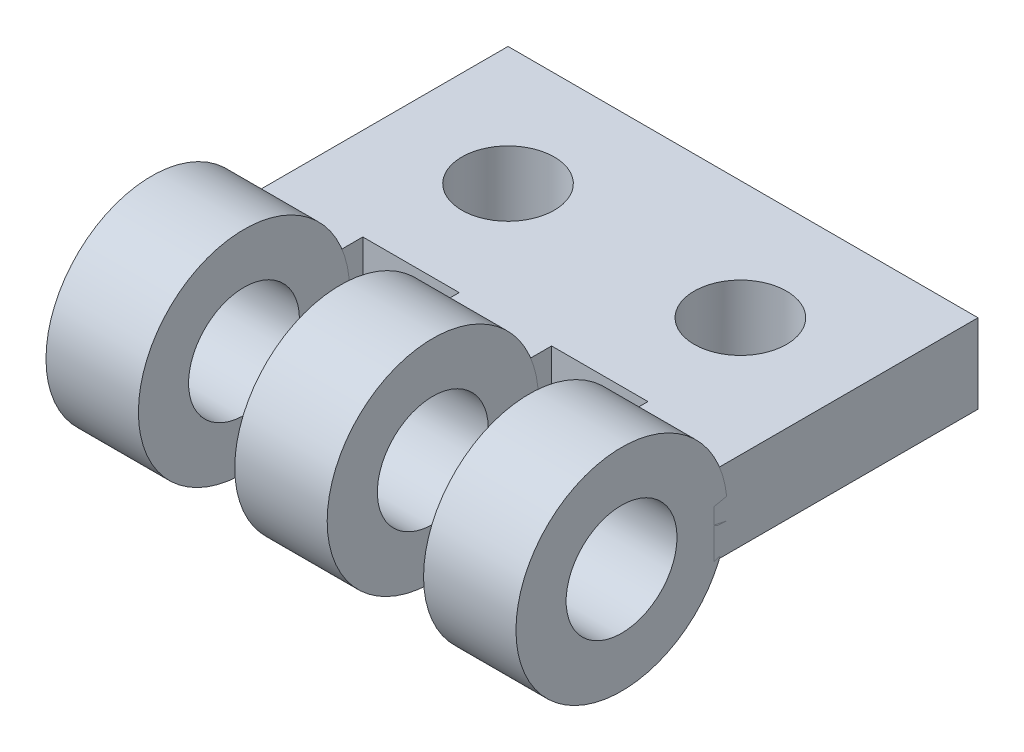
ISO-10303-21;
HEADER;
FILE_DESCRIPTION(('STEP AP214'),'2;1');
FILE_NAME('part.step','',(''),(''),'','','');
FILE_SCHEMA(('AUTOMOTIVE_DESIGN { 1 0 10303 214 1 1 1 1 }'));
ENDSEC;
DATA;
#1=APPLICATION_CONTEXT('core data for automotive mechanical design processes');
#2=APPLICATION_PROTOCOL_DEFINITION('international standard','automotive_design',2000,#1);
#3=PRODUCT_CONTEXT('',#1,'mechanical');
#4=PRODUCT('Part','Part','',(#3));
#5=PRODUCT_RELATED_PRODUCT_CATEGORY('part','',(#4));
#6=PRODUCT_DEFINITION_FORMATION('','',#4);
#7=PRODUCT_DEFINITION_CONTEXT('part definition',#1,'design');
#8=PRODUCT_DEFINITION('design','',#6,#7);
#9=PRODUCT_DEFINITION_SHAPE('','',#8);
#10=(LENGTH_UNIT() NAMED_UNIT(*) SI_UNIT(.MILLI.,.METRE.));
#11=(NAMED_UNIT(*) PLANE_ANGLE_UNIT() SI_UNIT($,.RADIAN.));
#12=(NAMED_UNIT(*) SI_UNIT($,.STERADIAN.) SOLID_ANGLE_UNIT());
#13=UNCERTAINTY_MEASURE_WITH_UNIT(LENGTH_MEASURE(1.E-05),#10,'distance_accuracy_value','');
#14=(GEOMETRIC_REPRESENTATION_CONTEXT(3) GLOBAL_UNCERTAINTY_ASSIGNED_CONTEXT((#13)) GLOBAL_UNIT_ASSIGNED_CONTEXT((#10,
#11,#12)) REPRESENTATION_CONTEXT('',''));
#15=CARTESIAN_POINT('',(0.,0.,0.));
#16=DIRECTION('',(0.,0.,1.));
#17=DIRECTION('',(1.,0.,0.));
#18=AXIS2_PLACEMENT_3D('',#15,#16,#17);
#19=CARTESIAN_POINT('',(-14.3,1.5,-13.5));
#20=DIRECTION('',(0.,1.,0.));
#21=DIRECTION('',(0.,0.,1.));
#22=AXIS2_PLACEMENT_3D('',#19,#20,#21);
#23=PLANE('',#22);
#24=CARTESIAN_POINT('',(-1.,1.5,-9.));
#25=DIRECTION('',(0.,1.,0.));
#26=DIRECTION('',(0.,0.,1.));
#27=AXIS2_PLACEMENT_3D('',#24,#25,#26);
#28=CIRCLE('',#27,1.75);
#29=CARTESIAN_POINT('',(-1.,1.5,-7.25));
#30=VERTEX_POINT('',#29);
#31=EDGE_CURVE('E196',#30,#30,#28,.T.);
#32=ORIENTED_EDGE('',*,*,#31,.F.);
#33=EDGE_LOOP('',(#32));
#34=FACE_BOUND('',#33,.T.);
#35=CARTESIAN_POINT('',(-9.8,1.5,-9.));
#36=DIRECTION('',(0.,1.,0.));
#37=DIRECTION('',(0.,0.,-1.));
#38=AXIS2_PLACEMENT_3D('',#35,#36,#37);
#39=CIRCLE('',#38,1.75);
#40=CARTESIAN_POINT('',(-9.8,1.5,-10.75));
#41=VERTEX_POINT('',#40);
#42=EDGE_CURVE('E193',#41,#41,#39,.T.);
#43=ORIENTED_EDGE('',*,*,#42,.F.);
#44=EDGE_LOOP('',(#43));
#45=FACE_BOUND('',#44,.T.);
#46=DIRECTION('',(1.,0.,0.));
#47=VECTOR('',#46,1.);
#48=CARTESIAN_POINT('',(-14.3,1.5,-4.5));
#49=LINE('',#48,#47);
#50=CARTESIAN_POINT('',(-10.8,1.5,-4.5));
#51=VERTEX_POINT('',#50);
#52=CARTESIAN_POINT('',(-7.15,1.5,-4.5));
#53=VERTEX_POINT('',#52);
#54=EDGE_CURVE('E158',#51,#53,#49,.T.);
#55=ORIENTED_EDGE('',*,*,#54,.T.);
#56=DIRECTION('',(0.,0.,1.));
#57=VECTOR('',#56,1.);
#58=CARTESIAN_POINT('',(-7.15,1.5,-13.5));
#59=LINE('',#58,#57);
#60=CARTESIAN_POINT('',(-7.15,1.5,-3.5));
#61=VERTEX_POINT('',#60);
#62=EDGE_CURVE('E171',#53,#61,#59,.T.);
#63=ORIENTED_EDGE('',*,*,#62,.T.);
#64=DIRECTION('',(-1.,0.,0.));
#65=VECTOR('',#64,1.);
#66=CARTESIAN_POINT('',(-14.3,1.5,-3.5));
#67=LINE('',#66,#65);
#68=CARTESIAN_POINT('',(-3.65,1.5,-3.5));
#69=VERTEX_POINT('',#68);
#70=EDGE_CURVE('E230',#69,#61,#67,.T.);
#71=ORIENTED_EDGE('',*,*,#70,.F.);
#72=DIRECTION('',(0.,0.,-1.));
#73=VECTOR('',#72,1.);
#74=CARTESIAN_POINT('',(-3.65,1.5,-13.5));
#75=LINE('',#74,#73);
#76=CARTESIAN_POINT('',(-3.65,1.5,-4.5));
#77=VERTEX_POINT('',#76);
#78=EDGE_CURVE('E79',#69,#77,#75,.T.);
#79=ORIENTED_EDGE('',*,*,#78,.T.);
#80=DIRECTION('',(1.,0.,0.));
#81=VECTOR('',#80,1.);
#82=CARTESIAN_POINT('',(-14.3,1.5,-4.5));
#83=LINE('',#82,#81);
#84=CARTESIAN_POINT('',(0.,1.5,-4.5));
#85=VERTEX_POINT('',#84);
#86=EDGE_CURVE('E195',#77,#85,#83,.T.);
#87=ORIENTED_EDGE('',*,*,#86,.T.);
#88=DIRECTION('',(0.,0.,1.));
#89=VECTOR('',#88,1.);
#90=CARTESIAN_POINT('',(0.,1.5,-13.5));
#91=LINE('',#90,#89);
#92=CARTESIAN_POINT('',(0.,1.5,-3.5));
#93=VERTEX_POINT('',#92);
#94=EDGE_CURVE('E186',#85,#93,#91,.T.);
#95=ORIENTED_EDGE('',*,*,#94,.T.);
#96=CARTESIAN_POINT('',(3.5,1.5,-3.5));
#97=VERTEX_POINT('',#96);
#98=EDGE_CURVE('E207',#97,#93,#67,.T.);
#99=ORIENTED_EDGE('',*,*,#98,.F.);
#100=DIRECTION('',(0.,0.,1.));
#101=VECTOR('',#100,1.);
#102=CARTESIAN_POINT('',(3.5,1.5,-13.5));
#103=LINE('',#102,#101);
#104=CARTESIAN_POINT('',(3.5,1.5,-13.5));
#105=VERTEX_POINT('',#104);
#106=EDGE_CURVE('E234',#105,#97,#103,.T.);
#107=ORIENTED_EDGE('',*,*,#106,.F.);
#108=DIRECTION('',(-1.,0.,0.));
#109=VECTOR('',#108,1.);
#110=CARTESIAN_POINT('',(-14.3,1.5,-13.5));
#111=LINE('',#110,#109);
#112=CARTESIAN_POINT('',(-14.3,1.5,-13.5));
#113=VERTEX_POINT('',#112);
#114=EDGE_CURVE('E215',#105,#113,#111,.T.);
#115=ORIENTED_EDGE('',*,*,#114,.T.);
#116=DIRECTION('',(0.,0.,1.));
#117=VECTOR('',#116,1.);
#118=CARTESIAN_POINT('',(-14.3,1.5,-13.5));
#119=LINE('',#118,#117);
#120=CARTESIAN_POINT('',(-14.3,1.5,-3.5));
#121=VERTEX_POINT('',#120);
#122=EDGE_CURVE('E229',#113,#121,#119,.T.);
#123=ORIENTED_EDGE('',*,*,#122,.T.);
#124=CARTESIAN_POINT('',(-10.8,1.5,-3.5));
#125=VERTEX_POINT('',#124);
#126=EDGE_CURVE('E228',#125,#121,#67,.T.);
#127=ORIENTED_EDGE('',*,*,#126,.F.);
#128=DIRECTION('',(0.,0.,-1.));
#129=VECTOR('',#128,1.);
#130=CARTESIAN_POINT('',(-10.8,1.5,-13.5));
#131=LINE('',#130,#129);
#132=EDGE_CURVE('E72',#125,#51,#131,.T.);
#133=ORIENTED_EDGE('',*,*,#132,.T.);
#134=EDGE_LOOP('',(#55,#63,#71,#79,#87,#95,#99,#107,#115,#123,#127,#133));
#135=FACE_BOUND('',#134,.T.);
#136=ADVANCED_FACE('F57',(#34,#45,#135),#23,.T.);
#137=CARTESIAN_POINT('',(-14.3,-1.5,-13.5));
#138=DIRECTION('',(0.,-1.,0.));
#139=DIRECTION('',(0.,0.,-1.));
#140=AXIS2_PLACEMENT_3D('',#137,#138,#139);
#141=PLANE('',#140);
#142=CARTESIAN_POINT('',(-1.,-1.5,-9.));
#143=DIRECTION('',(0.,-1.,0.));
#144=DIRECTION('',(0.,0.,-1.));
#145=AXIS2_PLACEMENT_3D('',#142,#143,#144);
#146=CIRCLE('',#145,1.75);
#147=CARTESIAN_POINT('',(-1.,-1.5,-10.75));
#148=VERTEX_POINT('',#147);
#149=EDGE_CURVE('E219',#148,#148,#146,.T.);
#150=ORIENTED_EDGE('',*,*,#149,.F.);
#151=EDGE_LOOP('',(#150));
#152=FACE_BOUND('',#151,.T.);
#153=CARTESIAN_POINT('',(-9.8,-1.5,-9.));
#154=DIRECTION('',(0.,-1.,0.));
#155=DIRECTION('',(0.,0.,-1.));
#156=AXIS2_PLACEMENT_3D('',#153,#154,#155);
#157=CIRCLE('',#156,1.75);
#158=CARTESIAN_POINT('',(-9.8,-1.5,-10.75));
#159=VERTEX_POINT('',#158);
#160=EDGE_CURVE('E197',#159,#159,#157,.T.);
#161=ORIENTED_EDGE('',*,*,#160,.F.);
#162=EDGE_LOOP('',(#161));
#163=FACE_BOUND('',#162,.T.);
#164=DIRECTION('',(1.,0.,0.));
#165=VECTOR('',#164,1.);
#166=CARTESIAN_POINT('',(-14.3,-1.5,-3.5));
#167=LINE('',#166,#165);
#168=CARTESIAN_POINT('',(-7.15,-1.5,-3.5));
#169=VERTEX_POINT('',#168);
#170=CARTESIAN_POINT('',(-3.65,-1.5,-3.5));
#171=VERTEX_POINT('',#170);
#172=EDGE_CURVE('E166',#169,#171,#167,.T.);
#173=ORIENTED_EDGE('',*,*,#172,.F.);
#174=DIRECTION('',(0.,0.,-1.));
#175=VECTOR('',#174,1.);
#176=CARTESIAN_POINT('',(-7.15,-1.5,-13.5));
#177=LINE('',#176,#175);
#178=CARTESIAN_POINT('',(-7.15,-1.5,-4.5));
#179=VERTEX_POINT('',#178);
#180=EDGE_CURVE('E168',#169,#179,#177,.T.);
#181=ORIENTED_EDGE('',*,*,#180,.T.);
#182=DIRECTION('',(-1.,0.,0.));
#183=VECTOR('',#182,1.);
#184=CARTESIAN_POINT('',(-14.3,-1.5,-4.5));
#185=LINE('',#184,#183);
#186=CARTESIAN_POINT('',(-10.8,-1.5,-4.5));
#187=VERTEX_POINT('',#186);
#188=EDGE_CURVE('E12',#179,#187,#185,.T.);
#189=ORIENTED_EDGE('',*,*,#188,.T.);
#190=DIRECTION('',(0.,0.,1.));
#191=VECTOR('',#190,1.);
#192=CARTESIAN_POINT('',(-10.8,-1.5,-13.5));
#193=LINE('',#192,#191);
#194=CARTESIAN_POINT('',(-10.8,-1.5,-3.5));
#195=VERTEX_POINT('',#194);
#196=EDGE_CURVE('E147',#187,#195,#193,.T.);
#197=ORIENTED_EDGE('',*,*,#196,.T.);
#198=CARTESIAN_POINT('',(-14.3,-1.5,-3.5));
#199=VERTEX_POINT('',#198);
#200=EDGE_CURVE('E222',#199,#195,#167,.T.);
#201=ORIENTED_EDGE('',*,*,#200,.F.);
#202=DIRECTION('',(0.,0.,1.));
#203=VECTOR('',#202,1.);
#204=CARTESIAN_POINT('',(-14.3,-1.5,-13.5));
#205=LINE('',#204,#203);
#206=CARTESIAN_POINT('',(-14.3,-1.5,-13.5));
#207=VERTEX_POINT('',#206);
#208=EDGE_CURVE('E213',#207,#199,#205,.T.);
#209=ORIENTED_EDGE('',*,*,#208,.F.);
#210=DIRECTION('',(1.,0.,0.));
#211=VECTOR('',#210,1.);
#212=CARTESIAN_POINT('',(-14.3,-1.5,-13.5));
#213=LINE('',#212,#211);
#214=CARTESIAN_POINT('',(3.5,-1.5,-13.5));
#215=VERTEX_POINT('',#214);
#216=EDGE_CURVE('E203',#207,#215,#213,.T.);
#217=ORIENTED_EDGE('',*,*,#216,.T.);
#218=DIRECTION('',(0.,0.,1.));
#219=VECTOR('',#218,1.);
#220=CARTESIAN_POINT('',(3.5,-1.5,-13.5));
#221=LINE('',#220,#219);
#222=CARTESIAN_POINT('',(3.5,-1.5,-3.5));
#223=VERTEX_POINT('',#222);
#224=EDGE_CURVE('E236',#215,#223,#221,.T.);
#225=ORIENTED_EDGE('',*,*,#224,.T.);
#226=CARTESIAN_POINT('',(0.,-1.5,-3.5));
#227=VERTEX_POINT('',#226);
#228=EDGE_CURVE('E217',#227,#223,#167,.T.);
#229=ORIENTED_EDGE('',*,*,#228,.F.);
#230=DIRECTION('',(0.,0.,-1.));
#231=VECTOR('',#230,1.);
#232=CARTESIAN_POINT('',(0.,-1.5,-13.5));
#233=LINE('',#232,#231);
#234=CARTESIAN_POINT('',(0.,-1.5,-4.5));
#235=VERTEX_POINT('',#234);
#236=EDGE_CURVE('E187',#227,#235,#233,.T.);
#237=ORIENTED_EDGE('',*,*,#236,.T.);
#238=DIRECTION('',(-1.,0.,0.));
#239=VECTOR('',#238,1.);
#240=CARTESIAN_POINT('',(-14.3,-1.5,-4.5));
#241=LINE('',#240,#239);
#242=CARTESIAN_POINT('',(-3.65,-1.5,-4.5));
#243=VERTEX_POINT('',#242);
#244=EDGE_CURVE('E247',#235,#243,#241,.T.);
#245=ORIENTED_EDGE('',*,*,#244,.T.);
#246=DIRECTION('',(0.,0.,1.));
#247=VECTOR('',#246,1.);
#248=CARTESIAN_POINT('',(-3.65,-1.5,-13.5));
#249=LINE('',#248,#247);
#250=EDGE_CURVE('E182',#243,#171,#249,.T.);
#251=ORIENTED_EDGE('',*,*,#250,.T.);
#252=EDGE_LOOP('',(#173,#181,#189,#197,#201,#209,#217,#225,#229,#237,#245,#251));
#253=FACE_BOUND('',#252,.T.);
#254=ADVANCED_FACE('F164',(#152,#163,#253),#141,.T.);
#255=CARTESIAN_POINT('',(0.,0.,-3.5));
#256=DIRECTION('',(0.,0.,1.));
#257=DIRECTION('',(1.,0.,0.));
#258=AXIS2_PLACEMENT_3D('',#255,#256,#257);
#259=PLANE('',#258);
#260=ORIENTED_EDGE('',*,*,#70,.T.);
#261=DIRECTION('',(0.,-1.,0.));
#262=VECTOR('',#261,1.);
#263=CARTESIAN_POINT('',(-7.15,0.,-3.5));
#264=LINE('',#263,#262);
#265=EDGE_CURVE('E61',#61,#169,#264,.T.);
#266=ORIENTED_EDGE('',*,*,#265,.T.);
#267=ORIENTED_EDGE('',*,*,#172,.T.);
#268=DIRECTION('',(0.,1.,0.));
#269=VECTOR('',#268,1.);
#270=CARTESIAN_POINT('',(-3.65,0.,-3.5));
#271=LINE('',#270,#269);
#272=EDGE_CURVE('E231',#171,#69,#271,.T.);
#273=ORIENTED_EDGE('',*,*,#272,.T.);
#274=EDGE_LOOP('',(#260,#266,#267,#273));
#275=FACE_BOUND('',#274,.T.);
#276=ADVANCED_FACE('F254',(#275),#259,.T.);
#277=ORIENTED_EDGE('',*,*,#200,.T.);
#278=DIRECTION('',(0.,1.,0.));
#279=VECTOR('',#278,1.);
#280=CARTESIAN_POINT('',(-10.8,0.,-3.5));
#281=LINE('',#280,#279);
#282=EDGE_CURVE('E148',#195,#125,#281,.T.);
#283=ORIENTED_EDGE('',*,*,#282,.T.);
#284=ORIENTED_EDGE('',*,*,#126,.T.);
#285=DIRECTION('',(0.,-1.,0.));
#286=VECTOR('',#285,1.);
#287=CARTESIAN_POINT('',(-14.3,1.5,-3.5));
#288=LINE('',#287,#286);
#289=EDGE_CURVE('E216',#121,#199,#288,.T.);
#290=ORIENTED_EDGE('',*,*,#289,.T.);
#291=EDGE_LOOP('',(#277,#283,#284,#290));
#292=FACE_BOUND('',#291,.T.);
#293=ADVANCED_FACE('F258',(#292),#259,.T.);
#294=ORIENTED_EDGE('',*,*,#98,.T.);
#295=DIRECTION('',(0.,-1.,0.));
#296=VECTOR('',#295,1.);
#297=CARTESIAN_POINT('',(0.,0.,-3.5));
#298=LINE('',#297,#296);
#299=EDGE_CURVE('E244',#93,#227,#298,.T.);
#300=ORIENTED_EDGE('',*,*,#299,.T.);
#301=ORIENTED_EDGE('',*,*,#228,.T.);
#302=DIRECTION('',(0.,1.,0.));
#303=VECTOR('',#302,1.);
#304=CARTESIAN_POINT('',(3.5,1.5,-3.5));
#305=LINE('',#304,#303);
#306=EDGE_CURVE('E225',#223,#97,#305,.T.);
#307=ORIENTED_EDGE('',*,*,#306,.T.);
#308=EDGE_LOOP('',(#294,#300,#301,#307));
#309=FACE_BOUND('',#308,.T.);
#310=ADVANCED_FACE('F268',(#309),#259,.T.);
#311=CARTESIAN_POINT('',(-14.3,1.5,-13.5));
#312=DIRECTION('',(-1.,0.,0.));
#313=DIRECTION('',(0.,0.,1.));
#314=AXIS2_PLACEMENT_3D('',#311,#312,#313);
#315=PLANE('',#314);
#316=ORIENTED_EDGE('',*,*,#289,.F.);
#317=ORIENTED_EDGE('',*,*,#122,.F.);
#318=DIRECTION('',(0.,-1.,0.));
#319=VECTOR('',#318,1.);
#320=CARTESIAN_POINT('',(-14.3,1.5,-13.5));
#321=LINE('',#320,#319);
#322=EDGE_CURVE('E204',#113,#207,#321,.T.);
#323=ORIENTED_EDGE('',*,*,#322,.T.);
#324=ORIENTED_EDGE('',*,*,#208,.T.);
#325=EDGE_LOOP('',(#316,#317,#323,#324));
#326=FACE_BOUND('',#325,.T.);
#327=ADVANCED_FACE('F59',(#326),#315,.T.);
#328=CARTESIAN_POINT('',(3.5,1.5,-13.5));
#329=DIRECTION('',(1.,0.,0.));
#330=DIRECTION('',(0.,0.,-1.));
#331=AXIS2_PLACEMENT_3D('',#328,#329,#330);
#332=PLANE('',#331);
#333=ORIENTED_EDGE('',*,*,#306,.F.);
#334=ORIENTED_EDGE('',*,*,#224,.F.);
#335=DIRECTION('',(0.,1.,0.));
#336=VECTOR('',#335,1.);
#337=CARTESIAN_POINT('',(3.5,1.5,-13.5));
#338=LINE('',#337,#336);
#339=EDGE_CURVE('E209',#215,#105,#338,.T.);
#340=ORIENTED_EDGE('',*,*,#339,.T.);
#341=ORIENTED_EDGE('',*,*,#106,.T.);
#342=EDGE_LOOP('',(#333,#334,#340,#341));
#343=FACE_BOUND('',#342,.T.);
#344=ADVANCED_FACE('F266',(#343),#332,.T.);
#345=CARTESIAN_POINT('',(0.,0.,-13.5));
#346=DIRECTION('',(0.,0.,1.));
#347=DIRECTION('',(1.,0.,0.));
#348=AXIS2_PLACEMENT_3D('',#345,#346,#347);
#349=PLANE('',#348);
#350=ORIENTED_EDGE('',*,*,#322,.F.);
#351=ORIENTED_EDGE('',*,*,#114,.F.);
#352=ORIENTED_EDGE('',*,*,#339,.F.);
#353=ORIENTED_EDGE('',*,*,#216,.F.);
#354=EDGE_LOOP('',(#350,#351,#352,#353));
#355=FACE_BOUND('',#354,.T.);
#356=ADVANCED_FACE('F267',(#355),#349,.F.);
#357=CARTESIAN_POINT('',(-9.8,-4.,-9.));
#358=DIRECTION('',(0.,1.,0.));
#359=DIRECTION('',(0.,0.,1.));
#360=AXIS2_PLACEMENT_3D('',#357,#358,#359);
#361=CYLINDRICAL_SURFACE('',#360,1.75);
#362=ORIENTED_EDGE('',*,*,#160,.T.);
#363=EDGE_LOOP('',(#362));
#364=FACE_BOUND('',#363,.T.);
#365=ORIENTED_EDGE('',*,*,#42,.T.);
#366=EDGE_LOOP('',(#365));
#367=FACE_BOUND('',#366,.T.);
#368=ADVANCED_FACE('F292',(#364,#367),#361,.F.);
#369=CARTESIAN_POINT('',(-1.,-4.,-9.));
#370=DIRECTION('',(0.,1.,0.));
#371=DIRECTION('',(0.,0.,1.));
#372=AXIS2_PLACEMENT_3D('',#369,#370,#371);
#373=CYLINDRICAL_SURFACE('',#372,1.75);
#374=ORIENTED_EDGE('',*,*,#149,.T.);
#375=EDGE_LOOP('',(#374));
#376=FACE_BOUND('',#375,.T.);
#377=ORIENTED_EDGE('',*,*,#31,.T.);
#378=EDGE_LOOP('',(#377));
#379=FACE_BOUND('',#378,.T.);
#380=ADVANCED_FACE('F294',(#376,#379),#373,.F.);
#381=CARTESIAN_POINT('',(0.,0.,0.));
#382=DIRECTION('',(-1.,0.,0.));
#383=DIRECTION('',(0.,0.,1.));
#384=AXIS2_PLACEMENT_3D('',#381,#382,#383);
#385=PLANE('',#384);
#386=DIRECTION('',(0.,-1.,0.));
#387=VECTOR('',#386,1.);
#388=CARTESIAN_POINT('',(0.,5.10942404367902,-4.5));
#389=LINE('',#388,#387);
#390=EDGE_CURVE('E178',#85,#235,#389,.T.);
#391=ORIENTED_EDGE('',*,*,#390,.T.);
#392=ORIENTED_EDGE('',*,*,#236,.F.);
#393=ORIENTED_EDGE('',*,*,#299,.F.);
#394=ORIENTED_EDGE('',*,*,#94,.F.);
#395=EDGE_LOOP('',(#391,#392,#393,#394));
#396=FACE_BOUND('',#395,.T.);
#397=ADVANCED_FACE('F299',(#396),#385,.T.);
#398=CARTESIAN_POINT('',(-17.2735292638166,5.10942404367902,-4.5));
#399=DIRECTION('',(0.,0.,1.));
#400=DIRECTION('',(0.,-1.,0.));
#401=AXIS2_PLACEMENT_3D('',#398,#399,#400);
#402=PLANE('',#401);
#403=DIRECTION('',(0.,1.,0.));
#404=VECTOR('',#403,1.);
#405=CARTESIAN_POINT('',(-3.65,5.10942404367902,-4.5));
#406=LINE('',#405,#404);
#407=EDGE_CURVE('E181',#243,#77,#406,.T.);
#408=ORIENTED_EDGE('',*,*,#407,.F.);
#409=ORIENTED_EDGE('',*,*,#244,.F.);
#410=ORIENTED_EDGE('',*,*,#390,.F.);
#411=ORIENTED_EDGE('',*,*,#86,.F.);
#412=EDGE_LOOP('',(#408,#409,#410,#411));
#413=FACE_BOUND('',#412,.T.);
#414=ADVANCED_FACE('F301',(#413),#402,.T.);
#415=CARTESIAN_POINT('',(-3.65,0.,0.));
#416=DIRECTION('',(1.,0.,0.));
#417=DIRECTION('',(0.,0.,-1.));
#418=AXIS2_PLACEMENT_3D('',#415,#416,#417);
#419=PLANE('',#418);
#420=ORIENTED_EDGE('',*,*,#272,.F.);
#421=ORIENTED_EDGE('',*,*,#250,.F.);
#422=ORIENTED_EDGE('',*,*,#407,.T.);
#423=ORIENTED_EDGE('',*,*,#78,.F.);
#424=EDGE_LOOP('',(#420,#421,#422,#423));
#425=FACE_BOUND('',#424,.T.);
#426=ADVANCED_FACE('F302',(#425),#419,.T.);
#427=CARTESIAN_POINT('',(-7.15,0.,0.));
#428=DIRECTION('',(-1.,0.,0.));
#429=DIRECTION('',(0.,0.,1.));
#430=AXIS2_PLACEMENT_3D('',#427,#428,#429);
#431=PLANE('',#430);
#432=DIRECTION('',(0.,-1.,0.));
#433=VECTOR('',#432,1.);
#434=CARTESIAN_POINT('',(-7.15,5.24142716015694,-4.5));
#435=LINE('',#434,#433);
#436=EDGE_CURVE('E163',#53,#179,#435,.T.);
#437=ORIENTED_EDGE('',*,*,#436,.T.);
#438=ORIENTED_EDGE('',*,*,#180,.F.);
#439=ORIENTED_EDGE('',*,*,#265,.F.);
#440=ORIENTED_EDGE('',*,*,#62,.F.);
#441=EDGE_LOOP('',(#437,#438,#439,#440));
#442=FACE_BOUND('',#441,.T.);
#443=ADVANCED_FACE('F253',(#442),#431,.T.);
#444=CARTESIAN_POINT('',(-24.5827131313632,5.24142716015694,-4.5));
#445=DIRECTION('',(0.,0.,1.));
#446=DIRECTION('',(0.,-1.,0.));
#447=AXIS2_PLACEMENT_3D('',#444,#445,#446);
#448=PLANE('',#447);
#449=DIRECTION('',(0.,1.,0.));
#450=VECTOR('',#449,1.);
#451=CARTESIAN_POINT('',(-10.8,5.24142716015694,-4.5));
#452=LINE('',#451,#450);
#453=EDGE_CURVE('E146',#187,#51,#452,.T.);
#454=ORIENTED_EDGE('',*,*,#453,.F.);
#455=ORIENTED_EDGE('',*,*,#188,.F.);
#456=ORIENTED_EDGE('',*,*,#436,.F.);
#457=ORIENTED_EDGE('',*,*,#54,.F.);
#458=EDGE_LOOP('',(#454,#455,#456,#457));
#459=FACE_BOUND('',#458,.T.);
#460=ADVANCED_FACE('F157',(#459),#448,.T.);
#461=CARTESIAN_POINT('',(-10.8,0.,0.));
#462=DIRECTION('',(1.,0.,0.));
#463=DIRECTION('',(0.,0.,-1.));
#464=AXIS2_PLACEMENT_3D('',#461,#462,#463);
#465=PLANE('',#464);
#466=ORIENTED_EDGE('',*,*,#282,.F.);
#467=ORIENTED_EDGE('',*,*,#196,.F.);
#468=ORIENTED_EDGE('',*,*,#453,.T.);
#469=ORIENTED_EDGE('',*,*,#132,.F.);
#470=EDGE_LOOP('',(#466,#467,#468,#469));
#471=FACE_BOUND('',#470,.T.);
#472=ADVANCED_FACE('F149',(#471),#465,.T.);
#473=CLOSED_SHELL('',(#136,#254,#276,#293,#310,#327,#344,#356,#368,#380,#397,#414,#426,#443,
#460,#472));
#474=MANIFOLD_SOLID_BREP('B2',#473);
#475=CARTESIAN_POINT('',(-10.8,0.,0.));
#476=DIRECTION('',(1.,0.,0.));
#477=DIRECTION('',(0.,0.,-1.));
#478=AXIS2_PLACEMENT_3D('',#475,#476,#477);
#479=PLANE('',#478);
#480=CARTESIAN_POINT('',(-10.8,0.,0.));
#481=DIRECTION('',(1.,0.,0.));
#482=DIRECTION('',(0.,0.,-1.));
#483=AXIS2_PLACEMENT_3D('',#480,#481,#482);
#484=CIRCLE('',#483,4.);
#485=CARTESIAN_POINT('',(-10.8,0.,-4.));
#486=VERTEX_POINT('',#485);
#487=EDGE_CURVE('E54',#486,#486,#484,.T.);
#488=ORIENTED_EDGE('',*,*,#487,.T.);
#489=EDGE_LOOP('',(#488));
#490=FACE_BOUND('',#489,.T.);
#491=CARTESIAN_POINT('',(-10.8,0.,0.));
#492=DIRECTION('',(1.,0.,0.));
#493=DIRECTION('',(0.,0.,-1.));
#494=AXIS2_PLACEMENT_3D('',#491,#492,#493);
#495=CIRCLE('',#494,2.1);
#496=CARTESIAN_POINT('',(-10.8,0.,-2.1));
#497=VERTEX_POINT('',#496);
#498=EDGE_CURVE('E442',#497,#497,#495,.T.);
#499=ORIENTED_EDGE('',*,*,#498,.F.);
#500=EDGE_LOOP('',(#499));
#501=FACE_BOUND('',#500,.T.);
#502=ADVANCED_FACE('F435',(#490,#501),#479,.T.);
#503=CARTESIAN_POINT('',(-14.3,0.,0.));
#504=DIRECTION('',(1.,0.,0.));
#505=DIRECTION('',(0.,0.,-1.));
#506=AXIS2_PLACEMENT_3D('',#503,#504,#505);
#507=PLANE('',#506);
#508=CARTESIAN_POINT('',(-14.3,0.,0.));
#509=DIRECTION('',(1.,0.,0.));
#510=DIRECTION('',(0.,0.,-1.));
#511=AXIS2_PLACEMENT_3D('',#508,#509,#510);
#512=CIRCLE('',#511,4.);
#513=CARTESIAN_POINT('',(-14.3,0.,-4.));
#514=VERTEX_POINT('',#513);
#515=EDGE_CURVE('E436',#514,#514,#512,.T.);
#516=ORIENTED_EDGE('',*,*,#515,.F.);
#517=EDGE_LOOP('',(#516));
#518=FACE_BOUND('',#517,.T.);
#519=CARTESIAN_POINT('',(-14.3,0.,0.));
#520=DIRECTION('',(1.,0.,0.));
#521=DIRECTION('',(0.,0.,-1.));
#522=AXIS2_PLACEMENT_3D('',#519,#520,#521);
#523=CIRCLE('',#522,2.1);
#524=CARTESIAN_POINT('',(-14.3,0.,-2.1));
#525=VERTEX_POINT('',#524);
#526=EDGE_CURVE('E444',#525,#525,#523,.T.);
#527=ORIENTED_EDGE('',*,*,#526,.T.);
#528=EDGE_LOOP('',(#527));
#529=FACE_BOUND('',#528,.T.);
#530=ADVANCED_FACE('F453',(#518,#529),#507,.F.);
#531=CARTESIAN_POINT('',(-10.8,0.,0.));
#532=DIRECTION('',(-1.,0.,0.));
#533=DIRECTION('',(0.,0.,1.));
#534=AXIS2_PLACEMENT_3D('',#531,#532,#533);
#535=CYLINDRICAL_SURFACE('',#534,4.);
#536=ORIENTED_EDGE('',*,*,#487,.F.);
#537=EDGE_LOOP('',(#536));
#538=FACE_BOUND('',#537,.T.);
#539=ORIENTED_EDGE('',*,*,#515,.T.);
#540=EDGE_LOOP('',(#539));
#541=FACE_BOUND('',#540,.T.);
#542=ADVANCED_FACE('F432',(#538,#541),#535,.T.);
#543=CARTESIAN_POINT('',(-10.8,0.,0.));
#544=DIRECTION('',(-1.,0.,0.));
#545=DIRECTION('',(0.,0.,1.));
#546=AXIS2_PLACEMENT_3D('',#543,#544,#545);
#547=CYLINDRICAL_SURFACE('',#546,2.1);
#548=ORIENTED_EDGE('',*,*,#498,.T.);
#549=EDGE_LOOP('',(#548));
#550=FACE_BOUND('',#549,.T.);
#551=ORIENTED_EDGE('',*,*,#526,.F.);
#552=EDGE_LOOP('',(#551));
#553=FACE_BOUND('',#552,.T.);
#554=ADVANCED_FACE('F452',(#550,#553),#547,.F.);
#555=CLOSED_SHELL('',(#502,#530,#542,#554));
#556=MANIFOLD_SOLID_BREP('B6',#555);
#557=CARTESIAN_POINT('',(-3.65,0.,0.));
#558=DIRECTION('',(1.,0.,0.));
#559=DIRECTION('',(0.,0.,-1.));
#560=AXIS2_PLACEMENT_3D('',#557,#558,#559);
#561=PLANE('',#560);
#562=CARTESIAN_POINT('',(-3.65,0.,0.));
#563=DIRECTION('',(1.,0.,0.));
#564=DIRECTION('',(0.,0.,-1.));
#565=AXIS2_PLACEMENT_3D('',#562,#563,#564);
#566=CIRCLE('',#565,4.);
#567=CARTESIAN_POINT('',(-3.65,0.,-4.));
#568=VERTEX_POINT('',#567);
#569=EDGE_CURVE('E431',#568,#568,#566,.T.);
#570=ORIENTED_EDGE('',*,*,#569,.T.);
#571=EDGE_LOOP('',(#570));
#572=FACE_BOUND('',#571,.T.);
#573=CARTESIAN_POINT('',(-3.65,0.,0.));
#574=DIRECTION('',(1.,0.,0.));
#575=DIRECTION('',(0.,0.,-1.));
#576=AXIS2_PLACEMENT_3D('',#573,#574,#575);
#577=CIRCLE('',#576,2.1);
#578=CARTESIAN_POINT('',(-3.65,0.,-2.1));
#579=VERTEX_POINT('',#578);
#580=EDGE_CURVE('E515',#579,#579,#577,.T.);
#581=ORIENTED_EDGE('',*,*,#580,.F.);
#582=EDGE_LOOP('',(#581));
#583=FACE_BOUND('',#582,.T.);
#584=ADVANCED_FACE('F501',(#572,#583),#561,.T.);
#585=CARTESIAN_POINT('',(-7.15,0.,0.));
#586=DIRECTION('',(1.,0.,0.));
#587=DIRECTION('',(0.,0.,-1.));
#588=AXIS2_PLACEMENT_3D('',#585,#586,#587);
#589=PLANE('',#588);
#590=CARTESIAN_POINT('',(-7.15,0.,0.));
#591=DIRECTION('',(1.,0.,0.));
#592=DIRECTION('',(0.,0.,-1.));
#593=AXIS2_PLACEMENT_3D('',#590,#591,#592);
#594=CIRCLE('',#593,4.);
#595=CARTESIAN_POINT('',(-7.15,0.,-4.));
#596=VERTEX_POINT('',#595);
#597=EDGE_CURVE('E504',#596,#596,#594,.T.);
#598=ORIENTED_EDGE('',*,*,#597,.F.);
#599=EDGE_LOOP('',(#598));
#600=FACE_BOUND('',#599,.T.);
#601=CARTESIAN_POINT('',(-7.15,0.,0.));
#602=DIRECTION('',(1.,0.,0.));
#603=DIRECTION('',(0.,0.,-1.));
#604=AXIS2_PLACEMENT_3D('',#601,#602,#603);
#605=CIRCLE('',#604,2.1);
#606=CARTESIAN_POINT('',(-7.15,0.,-2.1));
#607=VERTEX_POINT('',#606);
#608=EDGE_CURVE('E511',#607,#607,#605,.T.);
#609=ORIENTED_EDGE('',*,*,#608,.T.);
#610=EDGE_LOOP('',(#609));
#611=FACE_BOUND('',#610,.T.);
#612=ADVANCED_FACE('F522',(#600,#611),#589,.F.);
#613=CARTESIAN_POINT('',(-3.65,0.,0.));
#614=DIRECTION('',(-1.,0.,0.));
#615=DIRECTION('',(0.,0.,1.));
#616=AXIS2_PLACEMENT_3D('',#613,#614,#615);
#617=CYLINDRICAL_SURFACE('',#616,4.);
#618=ORIENTED_EDGE('',*,*,#569,.F.);
#619=EDGE_LOOP('',(#618));
#620=FACE_BOUND('',#619,.T.);
#621=ORIENTED_EDGE('',*,*,#597,.T.);
#622=EDGE_LOOP('',(#621));
#623=FACE_BOUND('',#622,.T.);
#624=ADVANCED_FACE('F503',(#620,#623),#617,.T.);
#625=CARTESIAN_POINT('',(-3.65,0.,0.));
#626=DIRECTION('',(-1.,0.,0.));
#627=DIRECTION('',(0.,0.,1.));
#628=AXIS2_PLACEMENT_3D('',#625,#626,#627);
#629=CYLINDRICAL_SURFACE('',#628,2.1);
#630=ORIENTED_EDGE('',*,*,#580,.T.);
#631=EDGE_LOOP('',(#630));
#632=FACE_BOUND('',#631,.T.);
#633=ORIENTED_EDGE('',*,*,#608,.F.);
#634=EDGE_LOOP('',(#633));
#635=FACE_BOUND('',#634,.T.);
#636=ADVANCED_FACE('F518',(#632,#635),#629,.F.);
#637=CLOSED_SHELL('',(#584,#612,#624,#636));
#638=MANIFOLD_SOLID_BREP('B49',#637);
#639=CARTESIAN_POINT('',(3.5,0.,0.));
#640=DIRECTION('',(1.,0.,0.));
#641=DIRECTION('',(0.,0.,-1.));
#642=AXIS2_PLACEMENT_3D('',#639,#640,#641);
#643=PLANE('',#642);
#644=CARTESIAN_POINT('',(3.5,0.,0.));
#645=DIRECTION('',(1.,0.,0.));
#646=DIRECTION('',(0.,0.,-1.));
#647=AXIS2_PLACEMENT_3D('',#644,#645,#646);
#648=CIRCLE('',#647,4.);
#649=CARTESIAN_POINT('',(3.5,0.,-4.));
#650=VERTEX_POINT('',#649);
#651=EDGE_CURVE('E499',#650,#650,#648,.T.);
#652=ORIENTED_EDGE('',*,*,#651,.T.);
#653=EDGE_LOOP('',(#652));
#654=FACE_BOUND('',#653,.T.);
#655=CARTESIAN_POINT('',(3.5,0.,0.));
#656=DIRECTION('',(1.,0.,0.));
#657=DIRECTION('',(0.,0.,-1.));
#658=AXIS2_PLACEMENT_3D('',#655,#656,#657);
#659=CIRCLE('',#658,2.1);
#660=CARTESIAN_POINT('',(3.5,0.,-2.1));
#661=VERTEX_POINT('',#660);
#662=EDGE_CURVE('E573',#661,#661,#659,.T.);
#663=ORIENTED_EDGE('',*,*,#662,.F.);
#664=EDGE_LOOP('',(#663));
#665=FACE_BOUND('',#664,.T.);
#666=ADVANCED_FACE('F563',(#654,#665),#643,.T.);
#667=CARTESIAN_POINT('',(0.,0.,0.));
#668=DIRECTION('',(1.,0.,0.));
#669=DIRECTION('',(0.,0.,-1.));
#670=AXIS2_PLACEMENT_3D('',#667,#668,#669);
#671=PLANE('',#670);
#672=CARTESIAN_POINT('',(0.,0.,0.));
#673=DIRECTION('',(1.,0.,0.));
#674=DIRECTION('',(0.,0.,-1.));
#675=AXIS2_PLACEMENT_3D('',#672,#673,#674);
#676=CIRCLE('',#675,4.);
#677=CARTESIAN_POINT('',(0.,0.,-4.));
#678=VERTEX_POINT('',#677);
#679=EDGE_CURVE('E570',#678,#678,#676,.T.);
#680=ORIENTED_EDGE('',*,*,#679,.F.);
#681=EDGE_LOOP('',(#680));
#682=FACE_BOUND('',#681,.T.);
#683=CARTESIAN_POINT('',(0.,0.,0.));
#684=DIRECTION('',(1.,0.,0.));
#685=DIRECTION('',(0.,0.,-1.));
#686=AXIS2_PLACEMENT_3D('',#683,#684,#685);
#687=CIRCLE('',#686,2.1);
#688=CARTESIAN_POINT('',(0.,0.,-2.1));
#689=VERTEX_POINT('',#688);
#690=EDGE_CURVE('E577',#689,#689,#687,.T.);
#691=ORIENTED_EDGE('',*,*,#690,.T.);
#692=EDGE_LOOP('',(#691));
#693=FACE_BOUND('',#692,.T.);
#694=ADVANCED_FACE('F586',(#682,#693),#671,.F.);
#695=CARTESIAN_POINT('',(3.5,0.,0.));
#696=DIRECTION('',(-1.,0.,0.));
#697=DIRECTION('',(0.,0.,1.));
#698=AXIS2_PLACEMENT_3D('',#695,#696,#697);
#699=CYLINDRICAL_SURFACE('',#698,4.);
#700=ORIENTED_EDGE('',*,*,#651,.F.);
#701=EDGE_LOOP('',(#700));
#702=FACE_BOUND('',#701,.T.);
#703=ORIENTED_EDGE('',*,*,#679,.T.);
#704=EDGE_LOOP('',(#703));
#705=FACE_BOUND('',#704,.T.);
#706=ADVANCED_FACE('F564',(#702,#705),#699,.T.);
#707=CARTESIAN_POINT('',(3.5,0.,0.));
#708=DIRECTION('',(-1.,0.,0.));
#709=DIRECTION('',(0.,0.,1.));
#710=AXIS2_PLACEMENT_3D('',#707,#708,#709);
#711=CYLINDRICAL_SURFACE('',#710,2.1);
#712=ORIENTED_EDGE('',*,*,#662,.T.);
#713=EDGE_LOOP('',(#712));
#714=FACE_BOUND('',#713,.T.);
#715=ORIENTED_EDGE('',*,*,#690,.F.);
#716=EDGE_LOOP('',(#715));
#717=FACE_BOUND('',#716,.T.);
#718=ADVANCED_FACE('F585',(#714,#717),#711,.F.);
#719=CLOSED_SHELL('',(#666,#694,#706,#718));
#720=MANIFOLD_SOLID_BREP('B428',#719);
#721=ADVANCED_BREP_SHAPE_REPRESENTATION('',(#18,#474,#556,#638,#720),#14);
#722=SHAPE_DEFINITION_REPRESENTATION(#9,#721);
ENDSEC;
END-ISO-10303-21;
